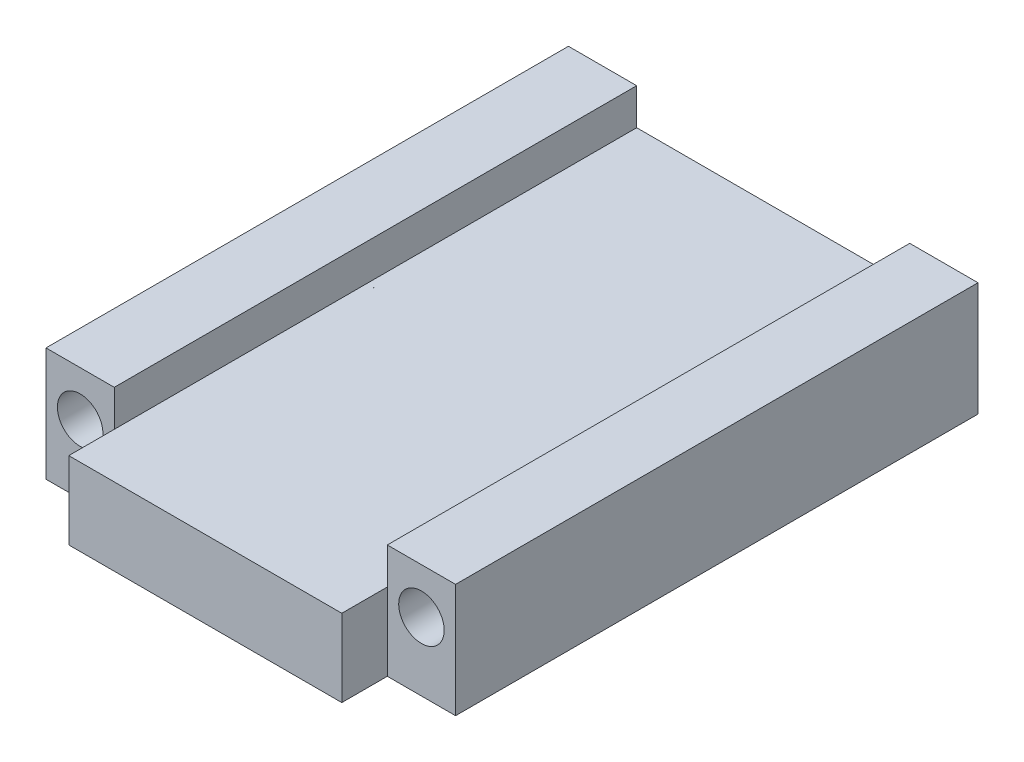
ISO-10303-21;
HEADER;
FILE_DESCRIPTION(('STEP AP214'),'2;1');
FILE_NAME('part.step','',(''),(''),'','','');
FILE_SCHEMA(('AUTOMOTIVE_DESIGN { 1 0 10303 214 1 1 1 1 }'));
ENDSEC;
DATA;
#1=APPLICATION_CONTEXT('core data for automotive mechanical design processes');
#2=APPLICATION_PROTOCOL_DEFINITION('international standard','automotive_design',2000,#1);
#3=PRODUCT_CONTEXT('',#1,'mechanical');
#4=PRODUCT('Part','Part','',(#3));
#5=PRODUCT_RELATED_PRODUCT_CATEGORY('part','',(#4));
#6=PRODUCT_DEFINITION_FORMATION('','',#4);
#7=PRODUCT_DEFINITION_CONTEXT('part definition',#1,'design');
#8=PRODUCT_DEFINITION('design','',#6,#7);
#9=PRODUCT_DEFINITION_SHAPE('','',#8);
#10=(LENGTH_UNIT() NAMED_UNIT(*) SI_UNIT(.MILLI.,.METRE.));
#11=(NAMED_UNIT(*) PLANE_ANGLE_UNIT() SI_UNIT($,.RADIAN.));
#12=(NAMED_UNIT(*) SI_UNIT($,.STERADIAN.) SOLID_ANGLE_UNIT());
#13=UNCERTAINTY_MEASURE_WITH_UNIT(LENGTH_MEASURE(1.E-05),#10,'distance_accuracy_value','');
#14=(GEOMETRIC_REPRESENTATION_CONTEXT(3) GLOBAL_UNCERTAINTY_ASSIGNED_CONTEXT((#13)) GLOBAL_UNIT_ASSIGNED_CONTEXT((#10,
#11,#12)) REPRESENTATION_CONTEXT('',''));
#15=CARTESIAN_POINT('',(0.,0.,0.));
#16=DIRECTION('',(0.,0.,1.));
#17=DIRECTION('',(1.,0.,0.));
#18=AXIS2_PLACEMENT_3D('',#15,#16,#17);
#19=CARTESIAN_POINT('',(-14.2875,-3.96875,39.624));
#20=DIRECTION('',(1.,0.,0.));
#21=DIRECTION('',(0.,0.,-1.));
#22=AXIS2_PLACEMENT_3D('',#19,#20,#21);
#23=PLANE('',#22);
#24=DIRECTION('',(0.,-1.,0.));
#25=VECTOR('',#24,1.);
#26=CARTESIAN_POINT('',(-14.2875,3.96875,36.449));
#27=LINE('',#26,#25);
#28=CARTESIAN_POINT('',(-14.2875,3.96875,36.449));
#29=VERTEX_POINT('',#28);
#30=CARTESIAN_POINT('',(-14.2875,-3.96875,36.449));
#31=VERTEX_POINT('',#30);
#32=EDGE_CURVE('E114',#29,#31,#27,.T.);
#33=ORIENTED_EDGE('',*,*,#32,.F.);
#34=DIRECTION('',(0.,0.,-1.));
#35=VECTOR('',#34,1.);
#36=CARTESIAN_POINT('',(-14.2875,3.96875,39.624));
#37=LINE('',#36,#35);
#38=CARTESIAN_POINT('',(-14.2875,3.96875,0.));
#39=VERTEX_POINT('',#38);
#40=EDGE_CURVE('E138',#29,#39,#37,.T.);
#41=ORIENTED_EDGE('',*,*,#40,.T.);
#42=DIRECTION('',(0.,-1.,0.));
#43=VECTOR('',#42,1.);
#44=CARTESIAN_POINT('',(-14.2875,-3.96875,0.));
#45=LINE('',#44,#43);
#46=CARTESIAN_POINT('',(-14.2875,-3.96875,0.));
#47=VERTEX_POINT('',#46);
#48=EDGE_CURVE('E137',#39,#47,#45,.T.);
#49=ORIENTED_EDGE('',*,*,#48,.T.);
#50=DIRECTION('',(0.,0.,-1.));
#51=VECTOR('',#50,1.);
#52=CARTESIAN_POINT('',(-14.2875,-3.96875,39.624));
#53=LINE('',#52,#51);
#54=EDGE_CURVE('E11',#31,#47,#53,.T.);
#55=ORIENTED_EDGE('',*,*,#54,.F.);
#56=EDGE_LOOP('',(#33,#41,#49,#55));
#57=FACE_BOUND('',#56,.T.);
#58=ADVANCED_FACE('F33',(#57),#23,.F.);
#59=CARTESIAN_POINT('',(14.2875,3.96875,39.624));
#60=DIRECTION('',(0.,-1.,0.));
#61=DIRECTION('',(1.,0.,0.));
#62=AXIS2_PLACEMENT_3D('',#59,#60,#61);
#63=PLANE('',#62);
#64=DIRECTION('',(-1.,0.,0.));
#65=VECTOR('',#64,1.);
#66=CARTESIAN_POINT('',(-14.2875,3.96875,36.449));
#67=LINE('',#66,#65);
#68=CARTESIAN_POINT('',(-9.525,3.96875,36.449));
#69=VERTEX_POINT('',#68);
#70=EDGE_CURVE('E121',#69,#29,#67,.T.);
#71=ORIENTED_EDGE('',*,*,#70,.F.);
#72=DIRECTION('',(0.,0.,1.));
#73=VECTOR('',#72,1.);
#74=CARTESIAN_POINT('',(-9.525,3.96875,0.));
#75=LINE('',#74,#73);
#76=CARTESIAN_POINT('',(-9.525,3.96875,0.));
#77=VERTEX_POINT('',#76);
#78=EDGE_CURVE('E203',#77,#69,#75,.T.);
#79=ORIENTED_EDGE('',*,*,#78,.F.);
#80=DIRECTION('',(-1.,0.,0.));
#81=VECTOR('',#80,1.);
#82=CARTESIAN_POINT('',(14.2875,3.96875,0.));
#83=LINE('',#82,#81);
#84=EDGE_CURVE('E156',#77,#39,#83,.T.);
#85=ORIENTED_EDGE('',*,*,#84,.T.);
#86=ORIENTED_EDGE('',*,*,#40,.F.);
#87=EDGE_LOOP('',(#71,#79,#85,#86));
#88=FACE_BOUND('',#87,.T.);
#89=ADVANCED_FACE('F248',(#88),#63,.F.);
#90=CARTESIAN_POINT('',(-9.525,1.42875,0.));
#91=DIRECTION('',(-1.,0.,0.));
#92=DIRECTION('',(0.,0.,1.));
#93=AXIS2_PLACEMENT_3D('',#90,#91,#92);
#94=PLANE('',#93);
#95=DIRECTION('',(0.,1.,0.));
#96=VECTOR('',#95,1.);
#97=CARTESIAN_POINT('',(-9.525,3.96875,36.449));
#98=LINE('',#97,#96);
#99=CARTESIAN_POINT('',(-9.525,1.42875,36.449));
#100=VERTEX_POINT('',#99);
#101=EDGE_CURVE('E133',#100,#69,#98,.T.);
#102=ORIENTED_EDGE('',*,*,#101,.F.);
#103=DIRECTION('',(0.,0.,1.));
#104=VECTOR('',#103,1.);
#105=CARTESIAN_POINT('',(-9.525,1.42875,0.));
#106=LINE('',#105,#104);
#107=CARTESIAN_POINT('',(-9.525,1.42875,0.));
#108=VERTEX_POINT('',#107);
#109=EDGE_CURVE('E209',#108,#100,#106,.T.);
#110=ORIENTED_EDGE('',*,*,#109,.F.);
#111=DIRECTION('',(0.,-1.,0.));
#112=VECTOR('',#111,1.);
#113=CARTESIAN_POINT('',(-9.525,1.42875,0.));
#114=LINE('',#113,#112);
#115=EDGE_CURVE('E194',#77,#108,#114,.T.);
#116=ORIENTED_EDGE('',*,*,#115,.F.);
#117=ORIENTED_EDGE('',*,*,#78,.T.);
#118=EDGE_LOOP('',(#102,#110,#116,#117));
#119=FACE_BOUND('',#118,.T.);
#120=ADVANCED_FACE('F245',(#119),#94,.F.);
#121=CARTESIAN_POINT('',(-11.90625,0.793750000000003,0.));
#122=DIRECTION('',(0.,0.,-1.));
#123=DIRECTION('',(-1.,0.,0.));
#124=AXIS2_PLACEMENT_3D('',#121,#122,#123);
#125=CYLINDRICAL_SURFACE('',#124,1.58749999999999);
#126=CARTESIAN_POINT('',(-11.90625,0.793750000000003,0.));
#127=DIRECTION('',(0.,0.,-1.));
#128=DIRECTION('',(-1.,0.,0.));
#129=AXIS2_PLACEMENT_3D('',#126,#127,#128);
#130=CIRCLE('',#129,1.5875);
#131=CARTESIAN_POINT('',(-13.49375,0.793750000000003,0.));
#132=VERTEX_POINT('',#131);
#133=EDGE_CURVE('E190',#132,#132,#130,.T.);
#134=ORIENTED_EDGE('',*,*,#133,.T.);
#135=EDGE_LOOP('',(#134));
#136=FACE_BOUND('',#135,.T.);
#137=CARTESIAN_POINT('',(-11.90625,0.793750000000003,36.449));
#138=DIRECTION('',(0.,0.,1.));
#139=DIRECTION('',(1.,0.,0.));
#140=AXIS2_PLACEMENT_3D('',#137,#138,#139);
#141=CIRCLE('',#140,1.58749999999999);
#142=CARTESIAN_POINT('',(-10.31875,0.793750000000003,36.449));
#143=VERTEX_POINT('',#142);
#144=EDGE_CURVE('E36',#143,#143,#141,.F.);
#145=ORIENTED_EDGE('',*,*,#144,.F.);
#146=EDGE_LOOP('',(#145));
#147=FACE_BOUND('',#146,.T.);
#148=ADVANCED_FACE('F255',(#136,#147),#125,.F.);
#149=DIRECTION('',(0.,0.,1.));
#150=VECTOR('',#149,1.);
#151=CARTESIAN_POINT('',(9.525,3.96875,0.));
#152=LINE('',#151,#150);
#153=CARTESIAN_POINT('',(9.525,3.96875,0.));
#154=VERTEX_POINT('',#153);
#155=CARTESIAN_POINT('',(9.525,3.96875,36.449));
#156=VERTEX_POINT('',#155);
#157=EDGE_CURVE('E143',#154,#156,#152,.T.);
#158=ORIENTED_EDGE('',*,*,#157,.T.);
#159=DIRECTION('',(-1.,0.,0.));
#160=VECTOR('',#159,1.);
#161=CARTESIAN_POINT('',(14.2875,3.96875,36.449));
#162=LINE('',#161,#160);
#163=CARTESIAN_POINT('',(14.2875,3.96875,36.449));
#164=VERTEX_POINT('',#163);
#165=EDGE_CURVE('E177',#164,#156,#162,.T.);
#166=ORIENTED_EDGE('',*,*,#165,.F.);
#167=DIRECTION('',(0.,0.,-1.));
#168=VECTOR('',#167,1.);
#169=CARTESIAN_POINT('',(14.2875,3.96875,39.624));
#170=LINE('',#169,#168);
#171=CARTESIAN_POINT('',(14.2875,3.96875,0.));
#172=VERTEX_POINT('',#171);
#173=EDGE_CURVE('E161',#164,#172,#170,.T.);
#174=ORIENTED_EDGE('',*,*,#173,.T.);
#175=EDGE_CURVE('E157',#172,#154,#83,.T.);
#176=ORIENTED_EDGE('',*,*,#175,.T.);
#177=EDGE_LOOP('',(#158,#166,#174,#176));
#178=FACE_BOUND('',#177,.T.);
#179=ADVANCED_FACE('F241',(#178),#63,.F.);
#180=CARTESIAN_POINT('',(14.2875,-3.96875,39.624));
#181=DIRECTION('',(0.,1.,0.));
#182=DIRECTION('',(-1.,0.,0.));
#183=AXIS2_PLACEMENT_3D('',#180,#181,#182);
#184=PLANE('',#183);
#185=DIRECTION('',(1.,0.,0.));
#186=VECTOR('',#185,1.);
#187=CARTESIAN_POINT('',(14.2875,-3.96875,39.624));
#188=LINE('',#187,#186);
#189=CARTESIAN_POINT('',(-9.525,-3.96875,39.624));
#190=VERTEX_POINT('',#189);
#191=CARTESIAN_POINT('',(9.525,-3.96875,39.624));
#192=VERTEX_POINT('',#191);
#193=EDGE_CURVE('E151',#190,#192,#188,.T.);
#194=ORIENTED_EDGE('',*,*,#193,.F.);
#195=DIRECTION('',(0.,0.,1.));
#196=VECTOR('',#195,1.);
#197=CARTESIAN_POINT('',(-9.525,-3.96875,36.449));
#198=LINE('',#197,#196);
#199=CARTESIAN_POINT('',(-9.525,-3.96875,36.449));
#200=VERTEX_POINT('',#199);
#201=EDGE_CURVE('E132',#200,#190,#198,.T.);
#202=ORIENTED_EDGE('',*,*,#201,.F.);
#203=DIRECTION('',(1.,0.,0.));
#204=VECTOR('',#203,1.);
#205=CARTESIAN_POINT('',(-14.2875,-3.96875,36.449));
#206=LINE('',#205,#204);
#207=EDGE_CURVE('E118',#31,#200,#206,.T.);
#208=ORIENTED_EDGE('',*,*,#207,.F.);
#209=ORIENTED_EDGE('',*,*,#54,.T.);
#210=DIRECTION('',(1.,0.,0.));
#211=VECTOR('',#210,1.);
#212=CARTESIAN_POINT('',(14.2875,-3.96875,0.));
#213=LINE('',#212,#211);
#214=CARTESIAN_POINT('',(14.2875,-3.96875,0.));
#215=VERTEX_POINT('',#214);
#216=EDGE_CURVE('E142',#47,#215,#213,.T.);
#217=ORIENTED_EDGE('',*,*,#216,.T.);
#218=DIRECTION('',(0.,0.,-1.));
#219=VECTOR('',#218,1.);
#220=CARTESIAN_POINT('',(14.2875,-3.96875,39.624));
#221=LINE('',#220,#219);
#222=CARTESIAN_POINT('',(14.2875,-3.96875,36.449));
#223=VERTEX_POINT('',#222);
#224=EDGE_CURVE('E41',#223,#215,#221,.T.);
#225=ORIENTED_EDGE('',*,*,#224,.F.);
#226=DIRECTION('',(1.,0.,0.));
#227=VECTOR('',#226,1.);
#228=CARTESIAN_POINT('',(14.2875,-3.96875,36.449));
#229=LINE('',#228,#227);
#230=CARTESIAN_POINT('',(9.525,-3.96875,36.449));
#231=VERTEX_POINT('',#230);
#232=EDGE_CURVE('E182',#231,#223,#229,.T.);
#233=ORIENTED_EDGE('',*,*,#232,.F.);
#234=DIRECTION('',(0.,0.,1.));
#235=VECTOR('',#234,1.);
#236=CARTESIAN_POINT('',(9.525,-3.96875,36.449));
#237=LINE('',#236,#235);
#238=EDGE_CURVE('E184',#231,#192,#237,.T.);
#239=ORIENTED_EDGE('',*,*,#238,.T.);
#240=EDGE_LOOP('',(#194,#202,#208,#209,#217,#225,#233,#239));
#241=FACE_BOUND('',#240,.T.);
#242=ADVANCED_FACE('F129',(#241),#184,.F.);
#243=CARTESIAN_POINT('',(14.2875,-3.96875,39.624));
#244=DIRECTION('',(-1.,0.,0.));
#245=DIRECTION('',(0.,0.,1.));
#246=AXIS2_PLACEMENT_3D('',#243,#244,#245);
#247=PLANE('',#246);
#248=ORIENTED_EDGE('',*,*,#173,.F.);
#249=DIRECTION('',(0.,1.,0.));
#250=VECTOR('',#249,1.);
#251=CARTESIAN_POINT('',(14.2875,3.96875,36.449));
#252=LINE('',#251,#250);
#253=EDGE_CURVE('E175',#223,#164,#252,.T.);
#254=ORIENTED_EDGE('',*,*,#253,.F.);
#255=ORIENTED_EDGE('',*,*,#224,.T.);
#256=DIRECTION('',(0.,1.,0.));
#257=VECTOR('',#256,1.);
#258=CARTESIAN_POINT('',(14.2875,-3.96875,0.));
#259=LINE('',#258,#257);
#260=EDGE_CURVE('E145',#215,#172,#259,.T.);
#261=ORIENTED_EDGE('',*,*,#260,.T.);
#262=EDGE_LOOP('',(#248,#254,#255,#261));
#263=FACE_BOUND('',#262,.T.);
#264=ADVANCED_FACE('F237',(#263),#247,.F.);
#265=CARTESIAN_POINT('',(0.,0.,39.624));
#266=DIRECTION('',(0.,0.,1.));
#267=DIRECTION('',(1.,0.,0.));
#268=AXIS2_PLACEMENT_3D('',#265,#266,#267);
#269=PLANE('',#268);
#270=DIRECTION('',(0.,1.,0.));
#271=VECTOR('',#270,1.);
#272=CARTESIAN_POINT('',(-9.525,3.96875,39.624));
#273=LINE('',#272,#271);
#274=CARTESIAN_POINT('',(-9.525,1.42875,39.624));
#275=VERTEX_POINT('',#274);
#276=EDGE_CURVE('E125',#190,#275,#273,.T.);
#277=ORIENTED_EDGE('',*,*,#276,.F.);
#278=ORIENTED_EDGE('',*,*,#193,.T.);
#279=DIRECTION('',(0.,-1.,0.));
#280=VECTOR('',#279,1.);
#281=CARTESIAN_POINT('',(9.525,3.96875,39.624));
#282=LINE('',#281,#280);
#283=CARTESIAN_POINT('',(9.525,1.42875,39.624));
#284=VERTEX_POINT('',#283);
#285=EDGE_CURVE('E178',#284,#192,#282,.T.);
#286=ORIENTED_EDGE('',*,*,#285,.F.);
#287=DIRECTION('',(1.,0.,0.));
#288=VECTOR('',#287,1.);
#289=CARTESIAN_POINT('',(9.525,1.42875,39.624));
#290=LINE('',#289,#288);
#291=EDGE_CURVE('E193',#275,#284,#290,.T.);
#292=ORIENTED_EDGE('',*,*,#291,.F.);
#293=EDGE_LOOP('',(#277,#278,#286,#292));
#294=FACE_BOUND('',#293,.T.);
#295=ADVANCED_FACE('F224',(#294),#269,.T.);
#296=CARTESIAN_POINT('',(0.,0.,0.));
#297=DIRECTION('',(0.,0.,1.));
#298=DIRECTION('',(1.,0.,0.));
#299=AXIS2_PLACEMENT_3D('',#296,#297,#298);
#300=PLANE('',#299);
#301=CARTESIAN_POINT('',(11.90625,0.793750000000003,0.));
#302=DIRECTION('',(0.,0.,-1.));
#303=DIRECTION('',(-1.,0.,0.));
#304=AXIS2_PLACEMENT_3D('',#301,#302,#303);
#305=CIRCLE('',#304,1.5875);
#306=CARTESIAN_POINT('',(10.31875,0.793750000000003,0.));
#307=VERTEX_POINT('',#306);
#308=EDGE_CURVE('E168',#307,#307,#305,.T.);
#309=ORIENTED_EDGE('',*,*,#308,.F.);
#310=EDGE_LOOP('',(#309));
#311=FACE_BOUND('',#310,.T.);
#312=ORIENTED_EDGE('',*,*,#133,.F.);
#313=EDGE_LOOP('',(#312));
#314=FACE_BOUND('',#313,.T.);
#315=DIRECTION('',(1.,0.,0.));
#316=VECTOR('',#315,1.);
#317=CARTESIAN_POINT('',(9.525,1.42875,0.));
#318=LINE('',#317,#316);
#319=CARTESIAN_POINT('',(9.525,1.42875,0.));
#320=VERTEX_POINT('',#319);
#321=EDGE_CURVE('E197',#108,#320,#318,.T.);
#322=ORIENTED_EDGE('',*,*,#321,.T.);
#323=DIRECTION('',(0.,1.,0.));
#324=VECTOR('',#323,1.);
#325=CARTESIAN_POINT('',(9.525,3.96875,0.));
#326=LINE('',#325,#324);
#327=EDGE_CURVE('E200',#320,#154,#326,.T.);
#328=ORIENTED_EDGE('',*,*,#327,.T.);
#329=ORIENTED_EDGE('',*,*,#175,.F.);
#330=ORIENTED_EDGE('',*,*,#260,.F.);
#331=ORIENTED_EDGE('',*,*,#216,.F.);
#332=ORIENTED_EDGE('',*,*,#48,.F.);
#333=ORIENTED_EDGE('',*,*,#84,.F.);
#334=ORIENTED_EDGE('',*,*,#115,.T.);
#335=EDGE_LOOP('',(#322,#328,#329,#330,#331,#332,#333,#334));
#336=FACE_BOUND('',#335,.T.);
#337=ADVANCED_FACE('F246',(#311,#314,#336),#300,.F.);
#338=CARTESIAN_POINT('',(9.525,3.96875,0.));
#339=DIRECTION('',(1.,0.,0.));
#340=DIRECTION('',(0.,0.,-1.));
#341=AXIS2_PLACEMENT_3D('',#338,#339,#340);
#342=PLANE('',#341);
#343=DIRECTION('',(0.,0.,1.));
#344=VECTOR('',#343,1.);
#345=CARTESIAN_POINT('',(9.525,1.42875,0.));
#346=LINE('',#345,#344);
#347=CARTESIAN_POINT('',(9.525,1.42875,36.449));
#348=VERTEX_POINT('',#347);
#349=EDGE_CURVE('E148',#320,#348,#346,.T.);
#350=ORIENTED_EDGE('',*,*,#349,.T.);
#351=DIRECTION('',(0.,-1.,0.));
#352=VECTOR('',#351,1.);
#353=CARTESIAN_POINT('',(9.525,3.96875,36.449));
#354=LINE('',#353,#352);
#355=EDGE_CURVE('E49',#156,#348,#354,.T.);
#356=ORIENTED_EDGE('',*,*,#355,.F.);
#357=ORIENTED_EDGE('',*,*,#157,.F.);
#358=ORIENTED_EDGE('',*,*,#327,.F.);
#359=EDGE_LOOP('',(#350,#356,#357,#358));
#360=FACE_BOUND('',#359,.T.);
#361=ADVANCED_FACE('F243',(#360),#342,.F.);
#362=CARTESIAN_POINT('',(9.525,1.42875,0.));
#363=DIRECTION('',(0.,-1.,0.));
#364=DIRECTION('',(0.,0.,-1.));
#365=AXIS2_PLACEMENT_3D('',#362,#363,#364);
#366=PLANE('',#365);
#367=ORIENTED_EDGE('',*,*,#291,.T.);
#368=EDGE_CURVE('E208',#348,#284,#346,.T.);
#369=ORIENTED_EDGE('',*,*,#368,.F.);
#370=ORIENTED_EDGE('',*,*,#349,.F.);
#371=ORIENTED_EDGE('',*,*,#321,.F.);
#372=ORIENTED_EDGE('',*,*,#109,.T.);
#373=EDGE_CURVE('E211',#100,#275,#106,.T.);
#374=ORIENTED_EDGE('',*,*,#373,.T.);
#375=EDGE_LOOP('',(#367,#369,#370,#371,#372,#374));
#376=FACE_BOUND('',#375,.T.);
#377=ADVANCED_FACE('F219',(#376),#366,.F.);
#378=CARTESIAN_POINT('',(11.90625,0.793750000000003,0.));
#379=DIRECTION('',(0.,0.,-1.));
#380=DIRECTION('',(-1.,0.,0.));
#381=AXIS2_PLACEMENT_3D('',#378,#379,#380);
#382=CYLINDRICAL_SURFACE('',#381,1.5875);
#383=CARTESIAN_POINT('',(11.90625,0.793750000000003,36.449));
#384=DIRECTION('',(0.,0.,-1.));
#385=DIRECTION('',(-1.,0.,0.));
#386=AXIS2_PLACEMENT_3D('',#383,#384,#385);
#387=CIRCLE('',#386,1.5875);
#388=CARTESIAN_POINT('',(10.31875,0.793750000000003,36.449));
#389=VERTEX_POINT('',#388);
#390=EDGE_CURVE('E163',#389,#389,#387,.F.);
#391=ORIENTED_EDGE('',*,*,#390,.T.);
#392=EDGE_LOOP('',(#391));
#393=FACE_BOUND('',#392,.T.);
#394=ORIENTED_EDGE('',*,*,#308,.T.);
#395=EDGE_LOOP('',(#394));
#396=FACE_BOUND('',#395,.T.);
#397=ADVANCED_FACE('F271',(#393,#396),#382,.F.);
#398=CARTESIAN_POINT('',(9.525,3.96875,36.449));
#399=DIRECTION('',(-1.,0.,0.));
#400=DIRECTION('',(0.,0.,1.));
#401=AXIS2_PLACEMENT_3D('',#398,#399,#400);
#402=PLANE('',#401);
#403=ORIENTED_EDGE('',*,*,#285,.T.);
#404=ORIENTED_EDGE('',*,*,#238,.F.);
#405=EDGE_CURVE('E180',#348,#231,#354,.T.);
#406=ORIENTED_EDGE('',*,*,#405,.F.);
#407=ORIENTED_EDGE('',*,*,#368,.T.);
#408=EDGE_LOOP('',(#403,#404,#406,#407));
#409=FACE_BOUND('',#408,.T.);
#410=ADVANCED_FACE('F228',(#409),#402,.F.);
#411=CARTESIAN_POINT('',(0.,0.,36.449));
#412=DIRECTION('',(0.,0.,-1.));
#413=DIRECTION('',(-1.,0.,0.));
#414=AXIS2_PLACEMENT_3D('',#411,#412,#413);
#415=PLANE('',#414);
#416=ORIENTED_EDGE('',*,*,#253,.T.);
#417=ORIENTED_EDGE('',*,*,#165,.T.);
#418=ORIENTED_EDGE('',*,*,#355,.T.);
#419=ORIENTED_EDGE('',*,*,#405,.T.);
#420=ORIENTED_EDGE('',*,*,#232,.T.);
#421=EDGE_LOOP('',(#416,#417,#418,#419,#420));
#422=FACE_BOUND('',#421,.T.);
#423=ORIENTED_EDGE('',*,*,#390,.F.);
#424=EDGE_LOOP('',(#423));
#425=FACE_BOUND('',#424,.T.);
#426=ADVANCED_FACE('F232',(#422,#425),#415,.F.);
#427=CARTESIAN_POINT('',(-9.525,3.96875,36.449));
#428=DIRECTION('',(1.,0.,0.));
#429=DIRECTION('',(0.,1.,0.));
#430=AXIS2_PLACEMENT_3D('',#427,#428,#429);
#431=PLANE('',#430);
#432=EDGE_CURVE('E57',#200,#100,#98,.T.);
#433=ORIENTED_EDGE('',*,*,#432,.F.);
#434=ORIENTED_EDGE('',*,*,#201,.T.);
#435=ORIENTED_EDGE('',*,*,#276,.T.);
#436=ORIENTED_EDGE('',*,*,#373,.F.);
#437=EDGE_LOOP('',(#433,#434,#435,#436));
#438=FACE_BOUND('',#437,.T.);
#439=ADVANCED_FACE('F293',(#438),#431,.F.);
#440=CARTESIAN_POINT('',(0.,0.,36.449));
#441=DIRECTION('',(0.,0.,1.));
#442=DIRECTION('',(1.,0.,0.));
#443=AXIS2_PLACEMENT_3D('',#440,#441,#442);
#444=PLANE('',#443);
#445=ORIENTED_EDGE('',*,*,#32,.T.);
#446=ORIENTED_EDGE('',*,*,#207,.T.);
#447=ORIENTED_EDGE('',*,*,#432,.T.);
#448=ORIENTED_EDGE('',*,*,#101,.T.);
#449=ORIENTED_EDGE('',*,*,#70,.T.);
#450=EDGE_LOOP('',(#445,#446,#447,#448,#449));
#451=FACE_BOUND('',#450,.T.);
#452=ORIENTED_EDGE('',*,*,#144,.T.);
#453=EDGE_LOOP('',(#452));
#454=FACE_BOUND('',#453,.T.);
#455=ADVANCED_FACE('F116',(#451,#454),#444,.T.);
#456=CLOSED_SHELL('',(#58,#89,#120,#148,#179,#242,#264,#295,#337,#361,#377,#397,#410,#426,#439,#455));
#457=MANIFOLD_SOLID_BREP('B2',#456);
#458=ADVANCED_BREP_SHAPE_REPRESENTATION('',(#18,#457),#14);
#459=SHAPE_DEFINITION_REPRESENTATION(#9,#458);
ENDSEC;
END-ISO-10303-21;
